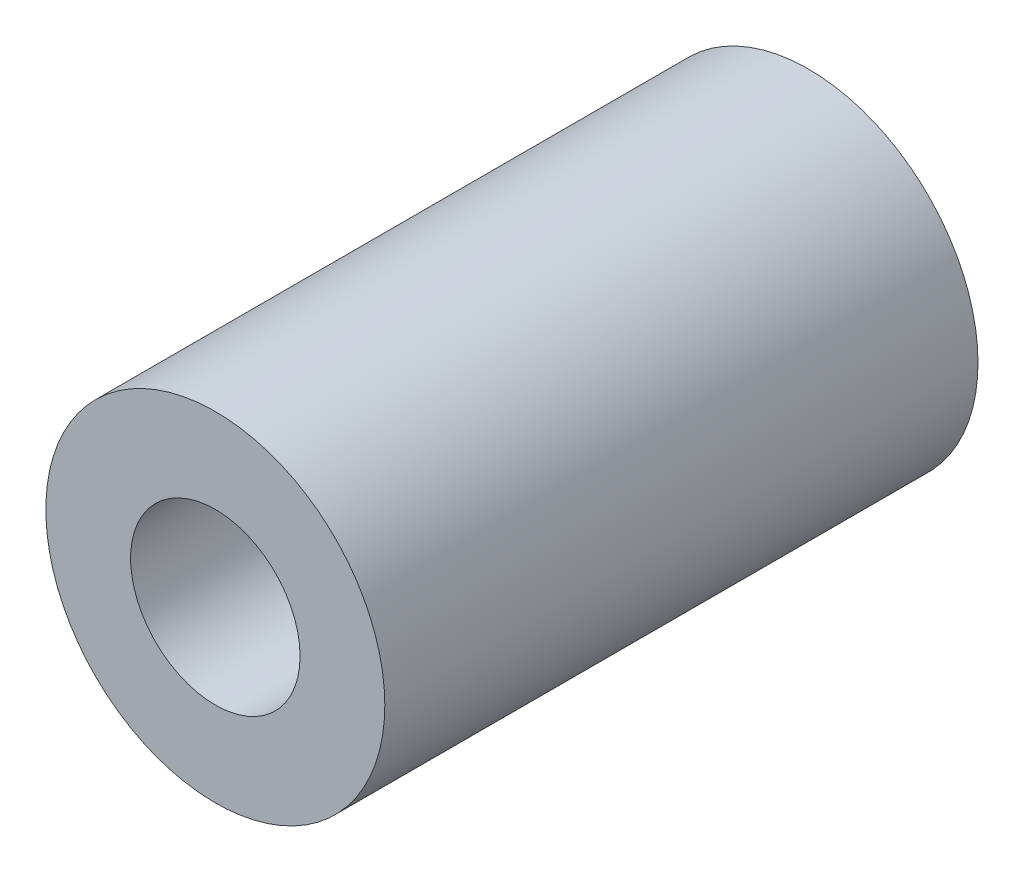
ISO-10303-21;
HEADER;
FILE_DESCRIPTION(('STEP AP214'),'2;1');
FILE_NAME('part.step','',(''),(''),'','','');
FILE_SCHEMA(('AUTOMOTIVE_DESIGN { 1 0 10303 214 1 1 1 1 }'));
ENDSEC;
DATA;
#1=APPLICATION_CONTEXT('core data for automotive mechanical design processes');
#2=APPLICATION_PROTOCOL_DEFINITION('international standard','automotive_design',2000,#1);
#3=PRODUCT_CONTEXT('',#1,'mechanical');
#4=PRODUCT('Part','Part','',(#3));
#5=PRODUCT_RELATED_PRODUCT_CATEGORY('part','',(#4));
#6=PRODUCT_DEFINITION_FORMATION('','',#4);
#7=PRODUCT_DEFINITION_CONTEXT('part definition',#1,'design');
#8=PRODUCT_DEFINITION('design','',#6,#7);
#9=PRODUCT_DEFINITION_SHAPE('','',#8);
#10=(LENGTH_UNIT() NAMED_UNIT(*) SI_UNIT(.MILLI.,.METRE.));
#11=(NAMED_UNIT(*) PLANE_ANGLE_UNIT() SI_UNIT($,.RADIAN.));
#12=(NAMED_UNIT(*) SI_UNIT($,.STERADIAN.) SOLID_ANGLE_UNIT());
#13=UNCERTAINTY_MEASURE_WITH_UNIT(LENGTH_MEASURE(1.E-05),#10,'distance_accuracy_value','');
#14=(GEOMETRIC_REPRESENTATION_CONTEXT(3) GLOBAL_UNCERTAINTY_ASSIGNED_CONTEXT((#13)) GLOBAL_UNIT_ASSIGNED_CONTEXT((#10,
#11,#12)) REPRESENTATION_CONTEXT('',''));
#15=CARTESIAN_POINT('',(0.,0.,0.));
#16=DIRECTION('',(0.,0.,1.));
#17=DIRECTION('',(1.,0.,0.));
#18=AXIS2_PLACEMENT_3D('',#15,#16,#17);
#19=CARTESIAN_POINT('',(0.,0.,3.5));
#20=DIRECTION('',(0.,0.,1.));
#21=DIRECTION('',(1.,0.,0.));
#22=AXIS2_PLACEMENT_3D('',#19,#20,#21);
#23=PLANE('',#22);
#24=CARTESIAN_POINT('',(0.,0.,3.5));
#25=DIRECTION('',(0.,0.,1.));
#26=DIRECTION('',(1.,0.,0.));
#27=AXIS2_PLACEMENT_3D('',#24,#25,#26);
#28=CIRCLE('',#27,1.);
#29=CARTESIAN_POINT('',(1.,0.,3.5));
#30=VERTEX_POINT('',#29);
#31=EDGE_CURVE('E10',#30,#30,#28,.T.);
#32=ORIENTED_EDGE('',*,*,#31,.T.);
#33=EDGE_LOOP('',(#32));
#34=FACE_BOUND('',#33,.T.);
#35=CARTESIAN_POINT('',(0.,0.,3.5));
#36=DIRECTION('',(0.,0.,1.));
#37=DIRECTION('',(1.,0.,0.));
#38=AXIS2_PLACEMENT_3D('',#35,#36,#37);
#39=CIRCLE('',#38,0.5);
#40=CARTESIAN_POINT('',(0.5,0.,3.5));
#41=VERTEX_POINT('',#40);
#42=EDGE_CURVE('E52',#41,#41,#39,.T.);
#43=ORIENTED_EDGE('',*,*,#42,.F.);
#44=EDGE_LOOP('',(#43));
#45=FACE_BOUND('',#44,.T.);
#46=ADVANCED_FACE('F39',(#34,#45),#23,.T.);
#47=CARTESIAN_POINT('',(0.,0.,0.));
#48=DIRECTION('',(0.,0.,1.));
#49=DIRECTION('',(1.,0.,0.));
#50=AXIS2_PLACEMENT_3D('',#47,#48,#49);
#51=PLANE('',#50);
#52=CARTESIAN_POINT('',(0.,0.,0.));
#53=DIRECTION('',(0.,0.,1.));
#54=DIRECTION('',(1.,0.,0.));
#55=AXIS2_PLACEMENT_3D('',#52,#53,#54);
#56=CIRCLE('',#55,1.);
#57=CARTESIAN_POINT('',(1.,0.,0.));
#58=VERTEX_POINT('',#57);
#59=EDGE_CURVE('E43',#58,#58,#56,.T.);
#60=ORIENTED_EDGE('',*,*,#59,.F.);
#61=EDGE_LOOP('',(#60));
#62=FACE_BOUND('',#61,.T.);
#63=CARTESIAN_POINT('',(0.,0.,0.));
#64=DIRECTION('',(0.,0.,1.));
#65=DIRECTION('',(1.,0.,0.));
#66=AXIS2_PLACEMENT_3D('',#63,#64,#65);
#67=CIRCLE('',#66,0.5);
#68=CARTESIAN_POINT('',(0.5,0.,0.));
#69=VERTEX_POINT('',#68);
#70=EDGE_CURVE('E54',#69,#69,#67,.T.);
#71=ORIENTED_EDGE('',*,*,#70,.T.);
#72=EDGE_LOOP('',(#71));
#73=FACE_BOUND('',#72,.T.);
#74=ADVANCED_FACE('F66',(#62,#73),#51,.F.);
#75=CARTESIAN_POINT('',(0.,0.,3.5));
#76=DIRECTION('',(0.,0.,-1.));
#77=DIRECTION('',(-1.,0.,0.));
#78=AXIS2_PLACEMENT_3D('',#75,#76,#77);
#79=CYLINDRICAL_SURFACE('',#78,1.);
#80=ORIENTED_EDGE('',*,*,#31,.F.);
#81=EDGE_LOOP('',(#80));
#82=FACE_BOUND('',#81,.T.);
#83=ORIENTED_EDGE('',*,*,#59,.T.);
#84=EDGE_LOOP('',(#83));
#85=FACE_BOUND('',#84,.T.);
#86=ADVANCED_FACE('F41',(#82,#85),#79,.T.);
#87=CARTESIAN_POINT('',(0.,0.,3.5));
#88=DIRECTION('',(0.,0.,-1.));
#89=DIRECTION('',(-1.,0.,0.));
#90=AXIS2_PLACEMENT_3D('',#87,#88,#89);
#91=CYLINDRICAL_SURFACE('',#90,0.5);
#92=ORIENTED_EDGE('',*,*,#42,.T.);
#93=EDGE_LOOP('',(#92));
#94=FACE_BOUND('',#93,.T.);
#95=ORIENTED_EDGE('',*,*,#70,.F.);
#96=EDGE_LOOP('',(#95));
#97=FACE_BOUND('',#96,.T.);
#98=ADVANCED_FACE('F62',(#94,#97),#91,.F.);
#99=CLOSED_SHELL('',(#46,#74,#86,#98));
#100=MANIFOLD_SOLID_BREP('B2',#99);
#101=ADVANCED_BREP_SHAPE_REPRESENTATION('',(#18,#100),#14);
#102=SHAPE_DEFINITION_REPRESENTATION(#9,#101);
ENDSEC;
END-ISO-10303-21;
